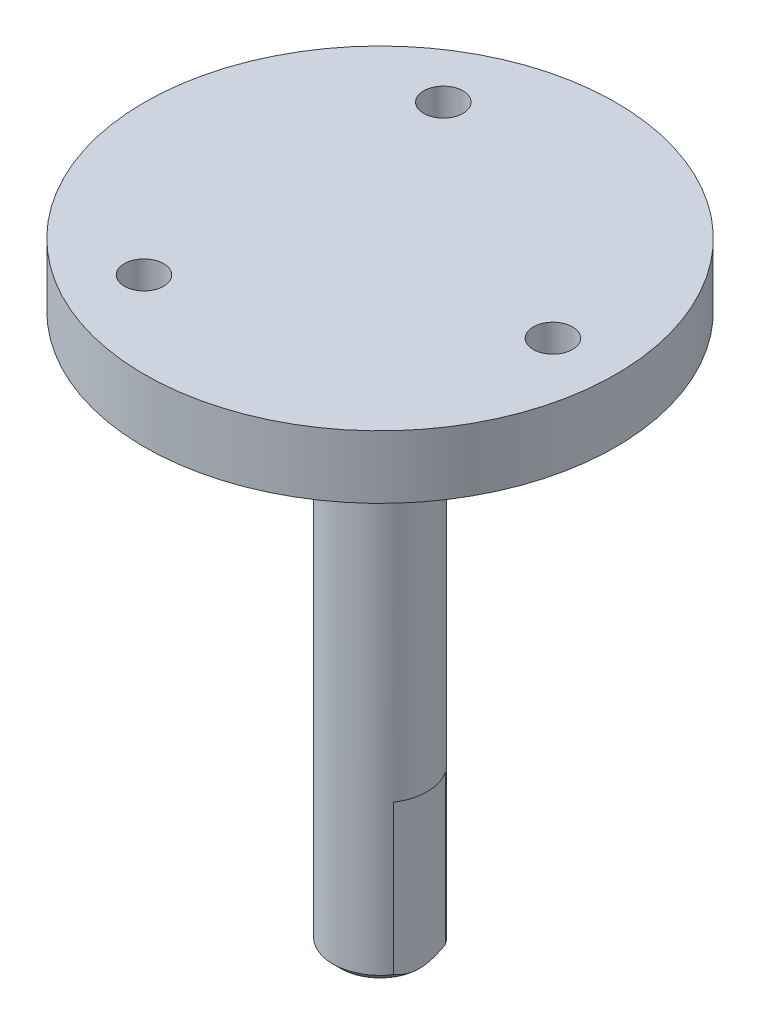
ISO-10303-21;
HEADER;
FILE_DESCRIPTION(('STEP AP214'),'2;1');
FILE_NAME('part.step','',(''),(''),'','','');
FILE_SCHEMA(('AUTOMOTIVE_DESIGN { 1 0 10303 214 1 1 1 1 }'));
ENDSEC;
DATA;
#1=APPLICATION_CONTEXT('core data for automotive mechanical design processes');
#2=APPLICATION_PROTOCOL_DEFINITION('international standard','automotive_design',2000,#1);
#3=PRODUCT_CONTEXT('',#1,'mechanical');
#4=PRODUCT('Part','Part','',(#3));
#5=PRODUCT_RELATED_PRODUCT_CATEGORY('part','',(#4));
#6=PRODUCT_DEFINITION_FORMATION('','',#4);
#7=PRODUCT_DEFINITION_CONTEXT('part definition',#1,'design');
#8=PRODUCT_DEFINITION('design','',#6,#7);
#9=PRODUCT_DEFINITION_SHAPE('','',#8);
#10=(LENGTH_UNIT() NAMED_UNIT(*) SI_UNIT(.MILLI.,.METRE.));
#11=(NAMED_UNIT(*) PLANE_ANGLE_UNIT() SI_UNIT($,.RADIAN.));
#12=(NAMED_UNIT(*) SI_UNIT($,.STERADIAN.) SOLID_ANGLE_UNIT());
#13=UNCERTAINTY_MEASURE_WITH_UNIT(LENGTH_MEASURE(1.E-05),#10,'distance_accuracy_value','');
#14=(GEOMETRIC_REPRESENTATION_CONTEXT(3) GLOBAL_UNCERTAINTY_ASSIGNED_CONTEXT((#13)) GLOBAL_UNIT_ASSIGNED_CONTEXT((#10,
#11,#12)) REPRESENTATION_CONTEXT('',''));
#15=CARTESIAN_POINT('',(0.,0.,0.));
#16=DIRECTION('',(0.,0.,1.));
#17=DIRECTION('',(1.,0.,0.));
#18=AXIS2_PLACEMENT_3D('',#15,#16,#17);
#19=CARTESIAN_POINT('',(0.,0.,0.));
#20=DIRECTION('',(0.,-1.,0.));
#21=DIRECTION('',(1.,0.,0.));
#22=AXIS2_PLACEMENT_3D('',#19,#20,#21);
#23=PLANE('',#22);
#24=CARTESIAN_POINT('',(0.,0.,0.));
#25=DIRECTION('',(0.,1.,0.));
#26=DIRECTION('',(-1.,0.,0.));
#27=AXIS2_PLACEMENT_3D('',#24,#25,#26);
#28=CIRCLE('',#27,15.);
#29=CARTESIAN_POINT('',(-15.,0.,0.));
#30=VERTEX_POINT('',#29);
#31=EDGE_CURVE('E169',#30,#30,#28,.T.);
#32=ORIENTED_EDGE('',*,*,#31,.T.);
#33=EDGE_LOOP('',(#32));
#34=FACE_BOUND('',#33,.T.);
#35=CARTESIAN_POINT('',(-5.5,0.,-9.52627944162883));
#36=DIRECTION('',(0.,1.,0.));
#37=DIRECTION('',(0.,0.,1.));
#38=AXIS2_PLACEMENT_3D('',#35,#36,#37);
#39=CIRCLE('',#38,1.25);
#40=CARTESIAN_POINT('',(-5.5,0.,-8.27627944162883));
#41=VERTEX_POINT('',#40);
#42=EDGE_CURVE('E181',#41,#41,#39,.T.);
#43=ORIENTED_EDGE('',*,*,#42,.F.);
#44=EDGE_LOOP('',(#43));
#45=FACE_BOUND('',#44,.T.);
#46=CARTESIAN_POINT('',(-5.5,0.,9.52627944162883));
#47=DIRECTION('',(0.,1.,0.));
#48=DIRECTION('',(0.,0.,1.));
#49=AXIS2_PLACEMENT_3D('',#46,#47,#48);
#50=CIRCLE('',#49,1.25);
#51=CARTESIAN_POINT('',(-5.5,0.,10.7762794416288));
#52=VERTEX_POINT('',#51);
#53=EDGE_CURVE('E193',#52,#52,#50,.T.);
#54=ORIENTED_EDGE('',*,*,#53,.F.);
#55=EDGE_LOOP('',(#54));
#56=FACE_BOUND('',#55,.T.);
#57=CARTESIAN_POINT('',(11.,0.,0.));
#58=DIRECTION('',(0.,1.,0.));
#59=DIRECTION('',(0.,0.,1.));
#60=AXIS2_PLACEMENT_3D('',#57,#58,#59);
#61=CIRCLE('',#60,1.25);
#62=CARTESIAN_POINT('',(11.,0.,1.25));
#63=VERTEX_POINT('',#62);
#64=EDGE_CURVE('E204',#63,#63,#61,.T.);
#65=ORIENTED_EDGE('',*,*,#64,.F.);
#66=EDGE_LOOP('',(#65));
#67=FACE_BOUND('',#66,.T.);
#68=ADVANCED_FACE('F55',(#34,#45,#56,#67),#23,.F.);
#69=CARTESIAN_POINT('',(0.,-39.,0.));
#70=DIRECTION('',(0.,-1.,0.));
#71=DIRECTION('',(1.,0.,0.));
#72=AXIS2_PLACEMENT_3D('',#69,#70,#71);
#73=CYLINDRICAL_SURFACE('',#72,3.);
#74=DIRECTION('',(0.,-1.,0.));
#75=VECTOR('',#74,1.);
#76=CARTESIAN_POINT('',(2.5,-29.,-1.65831239517771));
#77=LINE('',#76,#75);
#78=CARTESIAN_POINT('',(2.5,-29.,-1.6583123951777));
#79=VERTEX_POINT('',#78);
#80=CARTESIAN_POINT('',(2.5,-38.5,-1.65831239517771));
#81=VERTEX_POINT('',#80);
#82=EDGE_CURVE('E98',#79,#81,#77,.T.);
#83=ORIENTED_EDGE('',*,*,#82,.T.);
#84=CARTESIAN_POINT('',(0.,-38.5,0.));
#85=DIRECTION('',(0.,1.,0.));
#86=DIRECTION('',(-1.,0.,0.));
#87=AXIS2_PLACEMENT_3D('',#84,#85,#86);
#88=CIRCLE('',#87,3.);
#89=CARTESIAN_POINT('',(2.5,-38.5,1.65831239517771));
#90=VERTEX_POINT('',#89);
#91=EDGE_CURVE('E11',#81,#90,#88,.T.);
#92=ORIENTED_EDGE('',*,*,#91,.T.);
#93=DIRECTION('',(0.,-1.,0.));
#94=VECTOR('',#93,1.);
#95=CARTESIAN_POINT('',(2.5,-29.,1.65831239517771));
#96=LINE('',#95,#94);
#97=CARTESIAN_POINT('',(2.5,-29.,1.65831239517771));
#98=VERTEX_POINT('',#97);
#99=EDGE_CURVE('E96',#98,#90,#96,.T.);
#100=ORIENTED_EDGE('',*,*,#99,.F.);
#101=CARTESIAN_POINT('',(0.,-29.,0.));
#102=DIRECTION('',(0.,-1.,0.));
#103=DIRECTION('',(0.,0.,-1.));
#104=AXIS2_PLACEMENT_3D('',#101,#102,#103);
#105=CIRCLE('',#104,3.);
#106=EDGE_CURVE('E88',#79,#98,#105,.T.);
#107=ORIENTED_EDGE('',*,*,#106,.F.);
#108=EDGE_LOOP('',(#83,#92,#100,#107));
#109=FACE_BOUND('',#108,.T.);
#110=CARTESIAN_POINT('',(0.,-4.,0.));
#111=DIRECTION('',(0.,1.,0.));
#112=DIRECTION('',(-1.,0.,0.));
#113=AXIS2_PLACEMENT_3D('',#110,#111,#112);
#114=CIRCLE('',#113,3.);
#115=CARTESIAN_POINT('',(-3.,-4.,0.));
#116=VERTEX_POINT('',#115);
#117=EDGE_CURVE('E107',#116,#116,#114,.T.);
#118=ORIENTED_EDGE('',*,*,#117,.F.);
#119=EDGE_LOOP('',(#118));
#120=FACE_BOUND('',#119,.T.);
#121=ADVANCED_FACE('F101',(#109,#120),#73,.T.);
#122=CARTESIAN_POINT('',(0.,-39.,0.));
#123=DIRECTION('',(0.,1.,0.));
#124=DIRECTION('',(-1.,0.,0.));
#125=AXIS2_PLACEMENT_3D('',#122,#123,#124);
#126=PLANE('',#125);
#127=CARTESIAN_POINT('',(0.,-39.,0.));
#128=DIRECTION('',(0.,1.,0.));
#129=DIRECTION('',(-1.,0.,0.));
#130=AXIS2_PLACEMENT_3D('',#127,#128,#129);
#131=CIRCLE('',#130,2.5);
#132=CARTESIAN_POINT('',(2.5,-39.,0.));
#133=VERTEX_POINT('',#132);
#134=EDGE_CURVE('E113',#133,#133,#131,.F.);
#135=ORIENTED_EDGE('',*,*,#134,.T.);
#136=EDGE_LOOP('',(#135));
#137=FACE_BOUND('',#136,.T.);
#138=ADVANCED_FACE('F132',(#137),#126,.F.);
#139=CARTESIAN_POINT('',(2.5,-29.,0.));
#140=DIRECTION('',(-1.,0.,0.));
#141=DIRECTION('',(0.,-1.,0.));
#142=AXIS2_PLACEMENT_3D('',#139,#140,#141);
#143=PLANE('',#142);
#144=CARTESIAN_POINT('',(2.5,-38.5,1.6583123951777));
#145=CARTESIAN_POINT('',(2.5,-38.5250200255843,1.61304419071274));
#146=CARTESIAN_POINT('',(2.5,-38.549499427219,1.56747781751028));
#147=CARTESIAN_POINT('',(2.5,-38.5972096867305,1.47571363154993));
#148=CARTESIAN_POINT('',(2.5,-38.6204409038781,1.42951600534284));
#149=CARTESIAN_POINT('',(2.5,-38.688233741468,1.28946898250347));
#150=CARTESIAN_POINT('',(2.5,-38.7306685534991,1.19456817295725));
#151=CARTESIAN_POINT('',(2.5,-38.8071641313579,1.00435832661106));
#152=CARTESIAN_POINT('',(2.5,-38.8414185932365,0.909128166857117));
#153=CARTESIAN_POINT('',(2.5,-38.9011186383457,0.715960996402803));
#154=CARTESIAN_POINT('',(2.5,-38.9265705213043,0.618025975916638));
#155=CARTESIAN_POINT('',(2.5,-38.96395141614,0.434096531038003));
#156=CARTESIAN_POINT('',(2.5,-38.9772928993308,0.348395131920397));
#157=CARTESIAN_POINT('',(2.5,-38.9908266543301,0.218706232970866));
#158=CARTESIAN_POINT('',(2.5,-38.9942588205655,0.175042274887079));
#159=CARTESIAN_POINT('',(2.5,-38.9988484547413,0.0875881850216989));
#160=CARTESIAN_POINT('',(2.5,-39.0000055502065,0.043798033754823));
#161=CARTESIAN_POINT('',(2.5,-39.,0.));
#162=B_SPLINE_CURVE_WITH_KNOTS('',3,(#144,#145,#146,#147,#148,#149,#150,#151,#152,#153,#154,
#155,#156,#157,#158,#159,#160,#161),.UNSPECIFIED.,.F.,.F.,(4,2,2,2,2,2,2,2,4),(0.,
0.155160114661543,0.310275326953933,0.62188918746757,0.925164565305233,1.22822244720194,
1.48798349653102,1.61932602447731,1.75069005406606),.UNSPECIFIED.);
#163=EDGE_CURVE('E117',#90,#133,#162,.T.);
#164=ORIENTED_EDGE('',*,*,#163,.T.);
#165=CARTESIAN_POINT('',(2.5,-39.,0.));
#166=CARTESIAN_POINT('',(2.5,-39.0000643176381,-0.0768428391803918));
#167=CARTESIAN_POINT('',(2.5,-38.9964585669139,-0.153646619440306));
#168=CARTESIAN_POINT('',(2.5,-38.9824138186157,-0.306486913990634));
#169=CARTESIAN_POINT('',(2.5,-38.9719877566791,-0.382524604614596));
#170=CARTESIAN_POINT('',(2.5,-38.9450231886171,-0.532231201598347));
#171=CARTESIAN_POINT('',(2.5,-38.9285851348585,-0.605918543015132));
#172=CARTESIAN_POINT('',(2.5,-38.8903277696489,-0.751897163106776));
#173=CARTESIAN_POINT('',(2.5,-38.8685063602177,-0.824187885624661));
#174=CARTESIAN_POINT('',(2.5,-38.8222417065684,-0.96136120455938));
#175=CARTESIAN_POINT('',(2.5,-38.7981581621012,-1.02636662586388));
#176=CARTESIAN_POINT('',(2.5,-38.7466971992364,-1.1550556235554));
#177=CARTESIAN_POINT('',(2.5,-38.7193196398837,-1.21873914323978));
#178=CARTESIAN_POINT('',(2.5,-38.6613450460911,-1.34581351001768));
#179=CARTESIAN_POINT('',(2.5,-38.6307045192353,-1.40918435962137));
#180=CARTESIAN_POINT('',(2.5,-38.567035036112,-1.53466113602634));
#181=CARTESIAN_POINT('',(2.5,-38.5340077944289,-1.59676793059764));
#182=CARTESIAN_POINT('',(2.5,-38.5,-1.6583123951777));
#183=B_SPLINE_CURVE_WITH_KNOTS('',3,(#165,#166,#167,#168,#169,#170,#171,#172,#173,#174,#175,
#176,#177,#178,#179,#180,#181,#182),.UNSPECIFIED.,.F.,.F.,(4,2,2,2,2,2,2,2,4),(0.,
0.230381722715167,0.460327757459302,0.686595219702831,0.912951001700768,1.12081935764501,
1.32869661170078,1.53981070703046,1.75077462023261),.UNSPECIFIED.);
#184=EDGE_CURVE('E66',#133,#81,#183,.T.);
#185=ORIENTED_EDGE('',*,*,#184,.T.);
#186=ORIENTED_EDGE('',*,*,#82,.F.);
#187=DIRECTION('',(0.,0.,-1.));
#188=VECTOR('',#187,1.);
#189=CARTESIAN_POINT('',(2.5,-29.,0.));
#190=LINE('',#189,#188);
#191=EDGE_CURVE('E91',#98,#79,#190,.T.);
#192=ORIENTED_EDGE('',*,*,#191,.F.);
#193=ORIENTED_EDGE('',*,*,#99,.T.);
#194=EDGE_LOOP('',(#164,#185,#186,#192,#193));
#195=FACE_BOUND('',#194,.T.);
#196=ADVANCED_FACE('F95',(#195),#143,.F.);
#197=CARTESIAN_POINT('',(0.,-29.,0.));
#198=DIRECTION('',(0.,-1.,0.));
#199=DIRECTION('',(0.,0.,-1.));
#200=AXIS2_PLACEMENT_3D('',#197,#198,#199);
#201=PLANE('',#200);
#202=ORIENTED_EDGE('',*,*,#106,.T.);
#203=ORIENTED_EDGE('',*,*,#191,.T.);
#204=EDGE_LOOP('',(#202,#203));
#205=FACE_BOUND('',#204,.T.);
#206=ADVANCED_FACE('F90',(#205),#201,.T.);
#207=CARTESIAN_POINT('',(0.,-4.,0.));
#208=DIRECTION('',(0.,1.,0.));
#209=DIRECTION('',(-1.,0.,0.));
#210=AXIS2_PLACEMENT_3D('',#207,#208,#209);
#211=CYLINDRICAL_SURFACE('',#210,15.);
#212=CARTESIAN_POINT('',(0.,-4.,0.));
#213=DIRECTION('',(0.,1.,0.));
#214=DIRECTION('',(-1.,0.,0.));
#215=AXIS2_PLACEMENT_3D('',#212,#213,#214);
#216=CIRCLE('',#215,15.);
#217=CARTESIAN_POINT('',(-15.,-4.,0.));
#218=VERTEX_POINT('',#217);
#219=EDGE_CURVE('E93',#218,#218,#216,.T.);
#220=ORIENTED_EDGE('',*,*,#219,.T.);
#221=EDGE_LOOP('',(#220));
#222=FACE_BOUND('',#221,.T.);
#223=ORIENTED_EDGE('',*,*,#31,.F.);
#224=EDGE_LOOP('',(#223));
#225=FACE_BOUND('',#224,.T.);
#226=ADVANCED_FACE('F233',(#222,#225),#211,.T.);
#227=CARTESIAN_POINT('',(0.,-4.,0.));
#228=DIRECTION('',(0.,1.,0.));
#229=DIRECTION('',(-1.,0.,0.));
#230=AXIS2_PLACEMENT_3D('',#227,#228,#229);
#231=PLANE('',#230);
#232=CARTESIAN_POINT('',(11.,-4.,0.));
#233=DIRECTION('',(0.,1.,0.));
#234=DIRECTION('',(-1.,0.,0.));
#235=AXIS2_PLACEMENT_3D('',#232,#233,#234);
#236=CIRCLE('',#235,1.25);
#237=CARTESIAN_POINT('',(9.75,-4.,0.));
#238=VERTEX_POINT('',#237);
#239=EDGE_CURVE('E199',#238,#238,#236,.T.);
#240=ORIENTED_EDGE('',*,*,#239,.T.);
#241=EDGE_LOOP('',(#240));
#242=FACE_BOUND('',#241,.T.);
#243=CARTESIAN_POINT('',(-5.5,-4.,9.52627944162883));
#244=DIRECTION('',(0.,1.,0.));
#245=DIRECTION('',(-1.,0.,0.));
#246=AXIS2_PLACEMENT_3D('',#243,#244,#245);
#247=CIRCLE('',#246,1.25);
#248=CARTESIAN_POINT('',(-6.75,-4.,9.52627944162883));
#249=VERTEX_POINT('',#248);
#250=EDGE_CURVE('E187',#249,#249,#247,.T.);
#251=ORIENTED_EDGE('',*,*,#250,.T.);
#252=EDGE_LOOP('',(#251));
#253=FACE_BOUND('',#252,.T.);
#254=CARTESIAN_POINT('',(-5.5,-4.,-9.52627944162883));
#255=DIRECTION('',(0.,1.,0.));
#256=DIRECTION('',(-1.,0.,0.));
#257=AXIS2_PLACEMENT_3D('',#254,#255,#256);
#258=CIRCLE('',#257,1.25);
#259=CARTESIAN_POINT('',(-6.75,-4.,-9.52627944162883));
#260=VERTEX_POINT('',#259);
#261=EDGE_CURVE('E175',#260,#260,#258,.T.);
#262=ORIENTED_EDGE('',*,*,#261,.T.);
#263=EDGE_LOOP('',(#262));
#264=FACE_BOUND('',#263,.T.);
#265=ORIENTED_EDGE('',*,*,#117,.T.);
#266=EDGE_LOOP('',(#265));
#267=FACE_BOUND('',#266,.T.);
#268=ORIENTED_EDGE('',*,*,#219,.F.);
#269=EDGE_LOOP('',(#268));
#270=FACE_BOUND('',#269,.T.);
#271=ADVANCED_FACE('F230',(#242,#253,#264,#267,#270),#231,.F.);
#272=CARTESIAN_POINT('',(-5.5,0.,-9.52627944162883));
#273=DIRECTION('',(0.,1.,0.));
#274=DIRECTION('',(0.,0.,1.));
#275=AXIS2_PLACEMENT_3D('',#272,#273,#274);
#276=CYLINDRICAL_SURFACE('',#275,1.25);
#277=ORIENTED_EDGE('',*,*,#261,.F.);
#278=EDGE_LOOP('',(#277));
#279=FACE_BOUND('',#278,.T.);
#280=ORIENTED_EDGE('',*,*,#42,.T.);
#281=EDGE_LOOP('',(#280));
#282=FACE_BOUND('',#281,.T.);
#283=ADVANCED_FACE('F224',(#279,#282),#276,.F.);
#284=CARTESIAN_POINT('',(-5.5,0.,9.52627944162883));
#285=DIRECTION('',(0.,1.,0.));
#286=DIRECTION('',(0.,0.,1.));
#287=AXIS2_PLACEMENT_3D('',#284,#285,#286);
#288=CYLINDRICAL_SURFACE('',#287,1.25);
#289=ORIENTED_EDGE('',*,*,#250,.F.);
#290=EDGE_LOOP('',(#289));
#291=FACE_BOUND('',#290,.T.);
#292=ORIENTED_EDGE('',*,*,#53,.T.);
#293=EDGE_LOOP('',(#292));
#294=FACE_BOUND('',#293,.T.);
#295=ADVANCED_FACE('F215',(#291,#294),#288,.F.);
#296=CARTESIAN_POINT('',(11.,0.,0.));
#297=DIRECTION('',(0.,1.,0.));
#298=DIRECTION('',(0.,0.,1.));
#299=AXIS2_PLACEMENT_3D('',#296,#297,#298);
#300=CYLINDRICAL_SURFACE('',#299,1.25);
#301=ORIENTED_EDGE('',*,*,#239,.F.);
#302=EDGE_LOOP('',(#301));
#303=FACE_BOUND('',#302,.T.);
#304=ORIENTED_EDGE('',*,*,#64,.T.);
#305=EDGE_LOOP('',(#304));
#306=FACE_BOUND('',#305,.T.);
#307=ADVANCED_FACE('F212',(#303,#306),#300,.F.);
#308=CARTESIAN_POINT('',(0.,-39.,0.));
#309=DIRECTION('',(0.,1.,0.));
#310=DIRECTION('',(-1.,0.,0.));
#311=AXIS2_PLACEMENT_3D('',#308,#309,#310);
#312=CONICAL_SURFACE('',#311,2.5,0.785398163397455);
#313=ORIENTED_EDGE('',*,*,#163,.F.);
#314=ORIENTED_EDGE('',*,*,#91,.F.);
#315=ORIENTED_EDGE('',*,*,#184,.F.);
#316=ORIENTED_EDGE('',*,*,#134,.F.);
#317=EDGE_LOOP('',(#313,#314,#315,#316));
#318=FACE_BOUND('',#317,.T.);
#319=ADVANCED_FACE('F58',(#318),#312,.T.);
#320=CLOSED_SHELL('',(#68,#121,#138,#196,#206,#226,#271,#283,#295,#307,#319));
#321=MANIFOLD_SOLID_BREP('B2',#320);
#322=ADVANCED_BREP_SHAPE_REPRESENTATION('',(#18,#321),#14);
#323=SHAPE_DEFINITION_REPRESENTATION(#9,#322);
ENDSEC;
END-ISO-10303-21;
